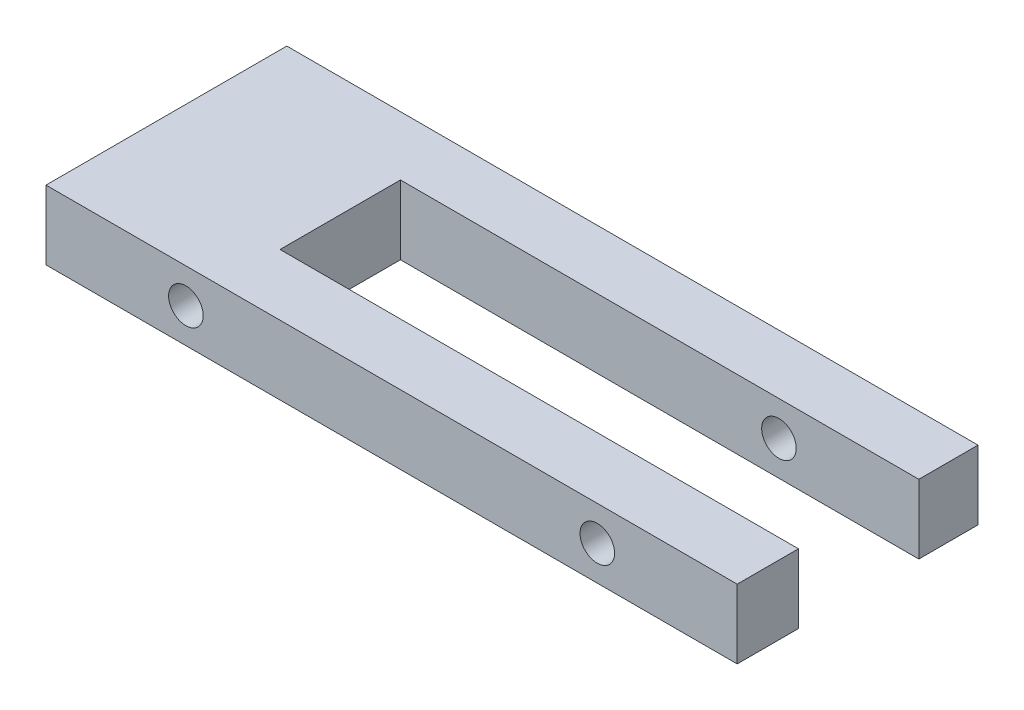
ISO-10303-21;
HEADER;
FILE_DESCRIPTION(('STEP AP214'),'2;1');
FILE_NAME('part.step','',(''),(''),'','','');
FILE_SCHEMA(('AUTOMOTIVE_DESIGN { 1 0 10303 214 1 1 1 1 }'));
ENDSEC;
DATA;
#1=APPLICATION_CONTEXT('core data for automotive mechanical design processes');
#2=APPLICATION_PROTOCOL_DEFINITION('international standard','automotive_design',2000,#1);
#3=PRODUCT_CONTEXT('',#1,'mechanical');
#4=PRODUCT('Part','Part','',(#3));
#5=PRODUCT_RELATED_PRODUCT_CATEGORY('part','',(#4));
#6=PRODUCT_DEFINITION_FORMATION('','',#4);
#7=PRODUCT_DEFINITION_CONTEXT('part definition',#1,'design');
#8=PRODUCT_DEFINITION('design','',#6,#7);
#9=PRODUCT_DEFINITION_SHAPE('','',#8);
#10=(LENGTH_UNIT() NAMED_UNIT(*) SI_UNIT(.MILLI.,.METRE.));
#11=(NAMED_UNIT(*) PLANE_ANGLE_UNIT() SI_UNIT($,.RADIAN.));
#12=(NAMED_UNIT(*) SI_UNIT($,.STERADIAN.) SOLID_ANGLE_UNIT());
#13=UNCERTAINTY_MEASURE_WITH_UNIT(LENGTH_MEASURE(1.E-05),#10,'distance_accuracy_value','');
#14=(GEOMETRIC_REPRESENTATION_CONTEXT(3) GLOBAL_UNCERTAINTY_ASSIGNED_CONTEXT((#13)) GLOBAL_UNIT_ASSIGNED_CONTEXT((#10,
#11,#12)) REPRESENTATION_CONTEXT('',''));
#15=CARTESIAN_POINT('',(0.,0.,0.));
#16=DIRECTION('',(0.,0.,1.));
#17=DIRECTION('',(1.,0.,0.));
#18=AXIS2_PLACEMENT_3D('',#15,#16,#17);
#19=CARTESIAN_POINT('',(-500.,-100.,177.207505518764));
#20=DIRECTION('',(0.,0.,-1.));
#21=DIRECTION('',(-1.,0.,0.));
#22=AXIS2_PLACEMENT_3D('',#19,#20,#21);
#23=PLANE('',#22);
#24=DIRECTION('',(-1.,0.,0.));
#25=VECTOR('',#24,1.);
#26=CARTESIAN_POINT('',(-500.,0.,177.207505518764));
#27=LINE('',#26,#25);
#28=CARTESIAN_POINT('',(500.,0.,177.207505518764));
#29=VERTEX_POINT('',#28);
#30=CARTESIAN_POINT('',(-500.,0.,177.207505518764));
#31=VERTEX_POINT('',#30);
#32=EDGE_CURVE('E124',#29,#31,#27,.T.);
#33=ORIENTED_EDGE('',*,*,#32,.T.);
#34=DIRECTION('',(0.,1.,0.));
#35=VECTOR('',#34,1.);
#36=CARTESIAN_POINT('',(-500.,-100.,177.207505518764));
#37=LINE('',#36,#35);
#38=CARTESIAN_POINT('',(-500.,-100.,177.207505518764));
#39=VERTEX_POINT('',#38);
#40=EDGE_CURVE('E121',#39,#31,#37,.T.);
#41=ORIENTED_EDGE('',*,*,#40,.F.);
#42=DIRECTION('',(-1.,0.,0.));
#43=VECTOR('',#42,1.);
#44=CARTESIAN_POINT('',(-500.,-100.,177.207505518764));
#45=LINE('',#44,#43);
#46=CARTESIAN_POINT('',(500.,-100.,177.207505518764));
#47=VERTEX_POINT('',#46);
#48=EDGE_CURVE('E110',#47,#39,#45,.T.);
#49=ORIENTED_EDGE('',*,*,#48,.F.);
#50=DIRECTION('',(0.,1.,0.));
#51=VECTOR('',#50,1.);
#52=CARTESIAN_POINT('',(500.,-100.,177.207505518764));
#53=LINE('',#52,#51);
#54=EDGE_CURVE('E125',#47,#29,#53,.T.);
#55=ORIENTED_EDGE('',*,*,#54,.T.);
#56=EDGE_LOOP('',(#33,#41,#49,#55));
#57=FACE_BOUND('',#56,.T.);
#58=CARTESIAN_POINT('',(-297.6,-50.,177.207505518764));
#59=DIRECTION('',(0.,0.,-1.));
#60=DIRECTION('',(-1.,0.,0.));
#61=AXIS2_PLACEMENT_3D('',#58,#59,#60);
#62=CIRCLE('',#61,25.);
#63=CARTESIAN_POINT('',(-322.6,-50.,177.207505518764));
#64=VERTEX_POINT('',#63);
#65=EDGE_CURVE('E192',#64,#64,#62,.T.);
#66=ORIENTED_EDGE('',*,*,#65,.T.);
#67=EDGE_LOOP('',(#66));
#68=FACE_BOUND('',#67,.T.);
#69=CARTESIAN_POINT('',(297.6,-50.,177.207505518764));
#70=DIRECTION('',(0.,0.,-1.));
#71=DIRECTION('',(-1.,0.,0.));
#72=AXIS2_PLACEMENT_3D('',#69,#70,#71);
#73=CIRCLE('',#72,25.);
#74=CARTESIAN_POINT('',(272.6,-50.,177.207505518764));
#75=VERTEX_POINT('',#74);
#76=EDGE_CURVE('E187',#75,#75,#73,.F.);
#77=ORIENTED_EDGE('',*,*,#76,.F.);
#78=EDGE_LOOP('',(#77));
#79=FACE_BOUND('',#78,.T.);
#80=ADVANCED_FACE('F37',(#57,#68,#79),#23,.F.);
#81=CARTESIAN_POINT('',(500.,-100.,-171.192494481236));
#82=DIRECTION('',(0.,0.,1.));
#83=DIRECTION('',(1.,0.,0.));
#84=AXIS2_PLACEMENT_3D('',#81,#82,#83);
#85=PLANE('',#84);
#86=DIRECTION('',(1.,0.,0.));
#87=VECTOR('',#86,1.);
#88=CARTESIAN_POINT('',(500.,0.,-171.192494481236));
#89=LINE('',#88,#87);
#90=CARTESIAN_POINT('',(-500.,0.,-171.192494481236));
#91=VERTEX_POINT('',#90);
#92=CARTESIAN_POINT('',(500.,0.,-171.192494481236));
#93=VERTEX_POINT('',#92);
#94=EDGE_CURVE('E89',#91,#93,#89,.T.);
#95=ORIENTED_EDGE('',*,*,#94,.T.);
#96=DIRECTION('',(0.,1.,0.));
#97=VECTOR('',#96,1.);
#98=CARTESIAN_POINT('',(500.,-100.,-171.192494481236));
#99=LINE('',#98,#97);
#100=CARTESIAN_POINT('',(500.,-100.,-171.192494481236));
#101=VERTEX_POINT('',#100);
#102=EDGE_CURVE('E130',#101,#93,#99,.T.);
#103=ORIENTED_EDGE('',*,*,#102,.F.);
#104=DIRECTION('',(1.,0.,0.));
#105=VECTOR('',#104,1.);
#106=CARTESIAN_POINT('',(500.,-100.,-171.192494481236));
#107=LINE('',#106,#105);
#108=CARTESIAN_POINT('',(-500.,-100.,-171.192494481236));
#109=VERTEX_POINT('',#108);
#110=EDGE_CURVE('E54',#109,#101,#107,.T.);
#111=ORIENTED_EDGE('',*,*,#110,.F.);
#112=DIRECTION('',(0.,1.,0.));
#113=VECTOR('',#112,1.);
#114=CARTESIAN_POINT('',(-500.,-100.,-171.192494481236));
#115=LINE('',#114,#113);
#116=EDGE_CURVE('E126',#109,#91,#115,.T.);
#117=ORIENTED_EDGE('',*,*,#116,.T.);
#118=EDGE_LOOP('',(#95,#103,#111,#117));
#119=FACE_BOUND('',#118,.T.);
#120=CARTESIAN_POINT('',(-297.6,-50.,-171.192494481236));
#121=DIRECTION('',(0.,0.,1.));
#122=DIRECTION('',(1.,0.,0.));
#123=AXIS2_PLACEMENT_3D('',#120,#121,#122);
#124=CIRCLE('',#123,25.);
#125=CARTESIAN_POINT('',(-272.6,-50.,-171.192494481236));
#126=VERTEX_POINT('',#125);
#127=EDGE_CURVE('E188',#126,#126,#124,.T.);
#128=ORIENTED_EDGE('',*,*,#127,.T.);
#129=EDGE_LOOP('',(#128));
#130=FACE_BOUND('',#129,.T.);
#131=CARTESIAN_POINT('',(297.6,-50.,-171.192494481236));
#132=DIRECTION('',(0.,0.,-1.));
#133=DIRECTION('',(-1.,0.,0.));
#134=AXIS2_PLACEMENT_3D('',#131,#132,#133);
#135=CIRCLE('',#134,25.);
#136=CARTESIAN_POINT('',(272.6,-50.,-171.192494481236));
#137=VERTEX_POINT('',#136);
#138=EDGE_CURVE('E191',#137,#137,#135,.T.);
#139=ORIENTED_EDGE('',*,*,#138,.F.);
#140=EDGE_LOOP('',(#139));
#141=FACE_BOUND('',#140,.T.);
#142=ADVANCED_FACE('F203',(#119,#130,#141),#85,.F.);
#143=CARTESIAN_POINT('',(500.,-100.,-171.192494481236));
#144=DIRECTION('',(-1.,0.,0.));
#145=DIRECTION('',(0.,0.,1.));
#146=AXIS2_PLACEMENT_3D('',#143,#144,#145);
#147=PLANE('',#146);
#148=DIRECTION('',(0.,0.,1.));
#149=VECTOR('',#148,1.);
#150=CARTESIAN_POINT('',(500.,0.,-171.192494481236));
#151=LINE('',#150,#149);
#152=CARTESIAN_POINT('',(500.,0.,-85.5962472406181));
#153=VERTEX_POINT('',#152);
#154=EDGE_CURVE('E134',#93,#153,#151,.T.);
#155=ORIENTED_EDGE('',*,*,#154,.T.);
#156=DIRECTION('',(0.,1.,0.));
#157=VECTOR('',#156,1.);
#158=CARTESIAN_POINT('',(500.,-100.,-85.5962472406181));
#159=LINE('',#158,#157);
#160=CARTESIAN_POINT('',(500.,-100.,-85.5962472406181));
#161=VERTEX_POINT('',#160);
#162=EDGE_CURVE('E11',#161,#153,#159,.T.);
#163=ORIENTED_EDGE('',*,*,#162,.F.);
#164=DIRECTION('',(0.,0.,1.));
#165=VECTOR('',#164,1.);
#166=CARTESIAN_POINT('',(500.,-100.,-171.192494481236));
#167=LINE('',#166,#165);
#168=EDGE_CURVE('E149',#101,#161,#167,.T.);
#169=ORIENTED_EDGE('',*,*,#168,.F.);
#170=ORIENTED_EDGE('',*,*,#102,.T.);
#171=EDGE_LOOP('',(#155,#163,#169,#170));
#172=FACE_BOUND('',#171,.T.);
#173=ADVANCED_FACE('F39',(#172),#147,.F.);
#174=CARTESIAN_POINT('',(500.,-100.,-85.5962472406181));
#175=DIRECTION('',(0.,0.,-1.));
#176=DIRECTION('',(-1.,0.,0.));
#177=AXIS2_PLACEMENT_3D('',#174,#175,#176);
#178=PLANE('',#177);
#179=CARTESIAN_POINT('',(297.6,-50.,-85.5962472406181));
#180=DIRECTION('',(0.,0.,-1.));
#181=DIRECTION('',(-1.,0.,0.));
#182=AXIS2_PLACEMENT_3D('',#179,#180,#181);
#183=CIRCLE('',#182,25.);
#184=CARTESIAN_POINT('',(272.6,-50.,-85.5962472406181));
#185=VERTEX_POINT('',#184);
#186=EDGE_CURVE('E138',#185,#185,#183,.T.);
#187=ORIENTED_EDGE('',*,*,#186,.T.);
#188=EDGE_LOOP('',(#187));
#189=FACE_BOUND('',#188,.T.);
#190=DIRECTION('',(-1.,0.,0.));
#191=VECTOR('',#190,1.);
#192=CARTESIAN_POINT('',(500.,0.,-85.5962472406181));
#193=LINE('',#192,#191);
#194=CARTESIAN_POINT('',(-250.,0.,-85.5962472406181));
#195=VERTEX_POINT('',#194);
#196=EDGE_CURVE('E137',#153,#195,#193,.T.);
#197=ORIENTED_EDGE('',*,*,#196,.T.);
#198=DIRECTION('',(0.,1.,0.));
#199=VECTOR('',#198,1.);
#200=CARTESIAN_POINT('',(-250.,-100.,-85.5962472406181));
#201=LINE('',#200,#199);
#202=CARTESIAN_POINT('',(-250.,-100.,-85.5962472406181));
#203=VERTEX_POINT('',#202);
#204=EDGE_CURVE('E46',#203,#195,#201,.T.);
#205=ORIENTED_EDGE('',*,*,#204,.F.);
#206=DIRECTION('',(-1.,0.,0.));
#207=VECTOR('',#206,1.);
#208=CARTESIAN_POINT('',(500.,-100.,-85.5962472406181));
#209=LINE('',#208,#207);
#210=EDGE_CURVE('E97',#161,#203,#209,.T.);
#211=ORIENTED_EDGE('',*,*,#210,.F.);
#212=ORIENTED_EDGE('',*,*,#162,.T.);
#213=EDGE_LOOP('',(#197,#205,#211,#212));
#214=FACE_BOUND('',#213,.T.);
#215=ADVANCED_FACE('F210',(#189,#214),#178,.F.);
#216=CARTESIAN_POINT('',(-250.,-100.,-85.5962472406181));
#217=DIRECTION('',(-1.,0.,0.));
#218=DIRECTION('',(0.,0.,1.));
#219=AXIS2_PLACEMENT_3D('',#216,#217,#218);
#220=PLANE('',#219);
#221=DIRECTION('',(0.,0.,1.));
#222=VECTOR('',#221,1.);
#223=CARTESIAN_POINT('',(-250.,0.,-85.5962472406181));
#224=LINE('',#223,#222);
#225=CARTESIAN_POINT('',(-250.,0.,88.6037527593819));
#226=VERTEX_POINT('',#225);
#227=EDGE_CURVE('E140',#195,#226,#224,.T.);
#228=ORIENTED_EDGE('',*,*,#227,.T.);
#229=DIRECTION('',(0.,1.,0.));
#230=VECTOR('',#229,1.);
#231=CARTESIAN_POINT('',(-250.,-100.,88.6037527593819));
#232=LINE('',#231,#230);
#233=CARTESIAN_POINT('',(-250.,-100.,88.6037527593819));
#234=VERTEX_POINT('',#233);
#235=EDGE_CURVE('E156',#234,#226,#232,.T.);
#236=ORIENTED_EDGE('',*,*,#235,.F.);
#237=DIRECTION('',(0.,0.,1.));
#238=VECTOR('',#237,1.);
#239=CARTESIAN_POINT('',(-250.,-100.,-85.5962472406181));
#240=LINE('',#239,#238);
#241=EDGE_CURVE('E164',#203,#234,#240,.T.);
#242=ORIENTED_EDGE('',*,*,#241,.F.);
#243=ORIENTED_EDGE('',*,*,#204,.T.);
#244=EDGE_LOOP('',(#228,#236,#242,#243));
#245=FACE_BOUND('',#244,.T.);
#246=ADVANCED_FACE('F162',(#245),#220,.F.);
#247=CARTESIAN_POINT('',(-250.,-100.,88.6037527593819));
#248=DIRECTION('',(0.,0.,1.));
#249=DIRECTION('',(1.,0.,0.));
#250=AXIS2_PLACEMENT_3D('',#247,#248,#249);
#251=PLANE('',#250);
#252=CARTESIAN_POINT('',(297.6,-50.,88.603752759382));
#253=DIRECTION('',(0.,0.,1.));
#254=DIRECTION('',(1.,0.,0.));
#255=AXIS2_PLACEMENT_3D('',#252,#253,#254);
#256=CIRCLE('',#255,25.);
#257=CARTESIAN_POINT('',(322.6,-50.,88.603752759382));
#258=VERTEX_POINT('',#257);
#259=EDGE_CURVE('E184',#258,#258,#256,.T.);
#260=ORIENTED_EDGE('',*,*,#259,.T.);
#261=EDGE_LOOP('',(#260));
#262=FACE_BOUND('',#261,.T.);
#263=DIRECTION('',(1.,0.,0.));
#264=VECTOR('',#263,1.);
#265=CARTESIAN_POINT('',(-250.,0.,88.6037527593819));
#266=LINE('',#265,#264);
#267=CARTESIAN_POINT('',(500.,0.,88.603752759382));
#268=VERTEX_POINT('',#267);
#269=EDGE_CURVE('E142',#226,#268,#266,.T.);
#270=ORIENTED_EDGE('',*,*,#269,.T.);
#271=DIRECTION('',(0.,1.,0.));
#272=VECTOR('',#271,1.);
#273=CARTESIAN_POINT('',(500.,-100.,88.603752759382));
#274=LINE('',#273,#272);
#275=CARTESIAN_POINT('',(500.,-100.,88.603752759382));
#276=VERTEX_POINT('',#275);
#277=EDGE_CURVE('E153',#276,#268,#274,.T.);
#278=ORIENTED_EDGE('',*,*,#277,.F.);
#279=DIRECTION('',(1.,0.,0.));
#280=VECTOR('',#279,1.);
#281=CARTESIAN_POINT('',(-250.,-100.,88.6037527593819));
#282=LINE('',#281,#280);
#283=EDGE_CURVE('E176',#234,#276,#282,.T.);
#284=ORIENTED_EDGE('',*,*,#283,.F.);
#285=ORIENTED_EDGE('',*,*,#235,.T.);
#286=EDGE_LOOP('',(#270,#278,#284,#285));
#287=FACE_BOUND('',#286,.T.);
#288=ADVANCED_FACE('F172',(#262,#287),#251,.F.);
#289=CARTESIAN_POINT('',(500.,-100.,88.603752759382));
#290=DIRECTION('',(-1.,0.,0.));
#291=DIRECTION('',(0.,0.,1.));
#292=AXIS2_PLACEMENT_3D('',#289,#290,#291);
#293=PLANE('',#292);
#294=DIRECTION('',(0.,0.,1.));
#295=VECTOR('',#294,1.);
#296=CARTESIAN_POINT('',(500.,0.,88.603752759382));
#297=LINE('',#296,#295);
#298=EDGE_CURVE('E144',#268,#29,#297,.T.);
#299=ORIENTED_EDGE('',*,*,#298,.T.);
#300=ORIENTED_EDGE('',*,*,#54,.F.);
#301=DIRECTION('',(0.,0.,1.));
#302=VECTOR('',#301,1.);
#303=CARTESIAN_POINT('',(500.,-100.,88.603752759382));
#304=LINE('',#303,#302);
#305=EDGE_CURVE('E116',#276,#47,#304,.T.);
#306=ORIENTED_EDGE('',*,*,#305,.F.);
#307=ORIENTED_EDGE('',*,*,#277,.T.);
#308=EDGE_LOOP('',(#299,#300,#306,#307));
#309=FACE_BOUND('',#308,.T.);
#310=ADVANCED_FACE('F175',(#309),#293,.F.);
#311=CARTESIAN_POINT('',(-500.,-100.,-171.192494481236));
#312=DIRECTION('',(1.,0.,0.));
#313=DIRECTION('',(0.,0.,-1.));
#314=AXIS2_PLACEMENT_3D('',#311,#312,#313);
#315=PLANE('',#314);
#316=DIRECTION('',(0.,0.,-1.));
#317=VECTOR('',#316,1.);
#318=CARTESIAN_POINT('',(-500.,0.,-171.192494481236));
#319=LINE('',#318,#317);
#320=EDGE_CURVE('E83',#31,#91,#319,.T.);
#321=ORIENTED_EDGE('',*,*,#320,.T.);
#322=ORIENTED_EDGE('',*,*,#116,.F.);
#323=DIRECTION('',(0.,0.,-1.));
#324=VECTOR('',#323,1.);
#325=CARTESIAN_POINT('',(-500.,-100.,-171.192494481236));
#326=LINE('',#325,#324);
#327=EDGE_CURVE('E114',#39,#109,#326,.T.);
#328=ORIENTED_EDGE('',*,*,#327,.F.);
#329=ORIENTED_EDGE('',*,*,#40,.T.);
#330=EDGE_LOOP('',(#321,#322,#328,#329));
#331=FACE_BOUND('',#330,.T.);
#332=ADVANCED_FACE('F128',(#331),#315,.F.);
#333=CARTESIAN_POINT('',(0.,-100.,0.));
#334=DIRECTION('',(0.,-1.,0.));
#335=DIRECTION('',(0.,0.,-1.));
#336=AXIS2_PLACEMENT_3D('',#333,#334,#335);
#337=PLANE('',#336);
#338=ORIENTED_EDGE('',*,*,#168,.T.);
#339=ORIENTED_EDGE('',*,*,#210,.T.);
#340=ORIENTED_EDGE('',*,*,#241,.T.);
#341=ORIENTED_EDGE('',*,*,#283,.T.);
#342=ORIENTED_EDGE('',*,*,#305,.T.);
#343=ORIENTED_EDGE('',*,*,#48,.T.);
#344=ORIENTED_EDGE('',*,*,#327,.T.);
#345=ORIENTED_EDGE('',*,*,#110,.T.);
#346=EDGE_LOOP('',(#338,#339,#340,#341,#342,#343,#344,#345));
#347=FACE_BOUND('',#346,.T.);
#348=ADVANCED_FACE('F112',(#347),#337,.T.);
#349=CARTESIAN_POINT('',(0.,0.,0.));
#350=DIRECTION('',(0.,-1.,0.));
#351=DIRECTION('',(0.,0.,-1.));
#352=AXIS2_PLACEMENT_3D('',#349,#350,#351);
#353=PLANE('',#352);
#354=ORIENTED_EDGE('',*,*,#154,.F.);
#355=ORIENTED_EDGE('',*,*,#94,.F.);
#356=ORIENTED_EDGE('',*,*,#320,.F.);
#357=ORIENTED_EDGE('',*,*,#32,.F.);
#358=ORIENTED_EDGE('',*,*,#298,.F.);
#359=ORIENTED_EDGE('',*,*,#269,.F.);
#360=ORIENTED_EDGE('',*,*,#227,.F.);
#361=ORIENTED_EDGE('',*,*,#196,.F.);
#362=EDGE_LOOP('',(#354,#355,#356,#357,#358,#359,#360,#361));
#363=FACE_BOUND('',#362,.T.);
#364=ADVANCED_FACE('F168',(#363),#353,.F.);
#365=CARTESIAN_POINT('',(-297.6,-50.,247.918183637419));
#366=DIRECTION('',(0.,0.,-1.));
#367=DIRECTION('',(-1.,0.,0.));
#368=AXIS2_PLACEMENT_3D('',#365,#366,#367);
#369=CYLINDRICAL_SURFACE('',#368,25.);
#370=ORIENTED_EDGE('',*,*,#65,.F.);
#371=EDGE_LOOP('',(#370));
#372=FACE_BOUND('',#371,.T.);
#373=ORIENTED_EDGE('',*,*,#127,.F.);
#374=EDGE_LOOP('',(#373));
#375=FACE_BOUND('',#374,.T.);
#376=ADVANCED_FACE('F234',(#372,#375),#369,.F.);
#377=CARTESIAN_POINT('',(297.6,-50.,247.918183637419));
#378=DIRECTION('',(0.,0.,-1.));
#379=DIRECTION('',(-1.,0.,0.));
#380=AXIS2_PLACEMENT_3D('',#377,#378,#379);
#381=CYLINDRICAL_SURFACE('',#380,25.);
#382=ORIENTED_EDGE('',*,*,#138,.T.);
#383=EDGE_LOOP('',(#382));
#384=FACE_BOUND('',#383,.T.);
#385=ORIENTED_EDGE('',*,*,#186,.F.);
#386=EDGE_LOOP('',(#385));
#387=FACE_BOUND('',#386,.T.);
#388=ADVANCED_FACE('F200',(#384,#387),#381,.F.);
#389=ORIENTED_EDGE('',*,*,#76,.T.);
#390=EDGE_LOOP('',(#389));
#391=FACE_BOUND('',#390,.T.);
#392=ORIENTED_EDGE('',*,*,#259,.F.);
#393=EDGE_LOOP('',(#392));
#394=FACE_BOUND('',#393,.T.);
#395=ADVANCED_FACE('F233',(#391,#394),#381,.F.);
#396=CLOSED_SHELL('',(#80,#142,#173,#215,#246,#288,#310,#332,#348,#364,#376,#388,#395));
#397=MANIFOLD_SOLID_BREP('B2',#396);
#398=ADVANCED_BREP_SHAPE_REPRESENTATION('',(#18,#397),#14);
#399=SHAPE_DEFINITION_REPRESENTATION(#9,#398);
ENDSEC;
END-ISO-10303-21;
